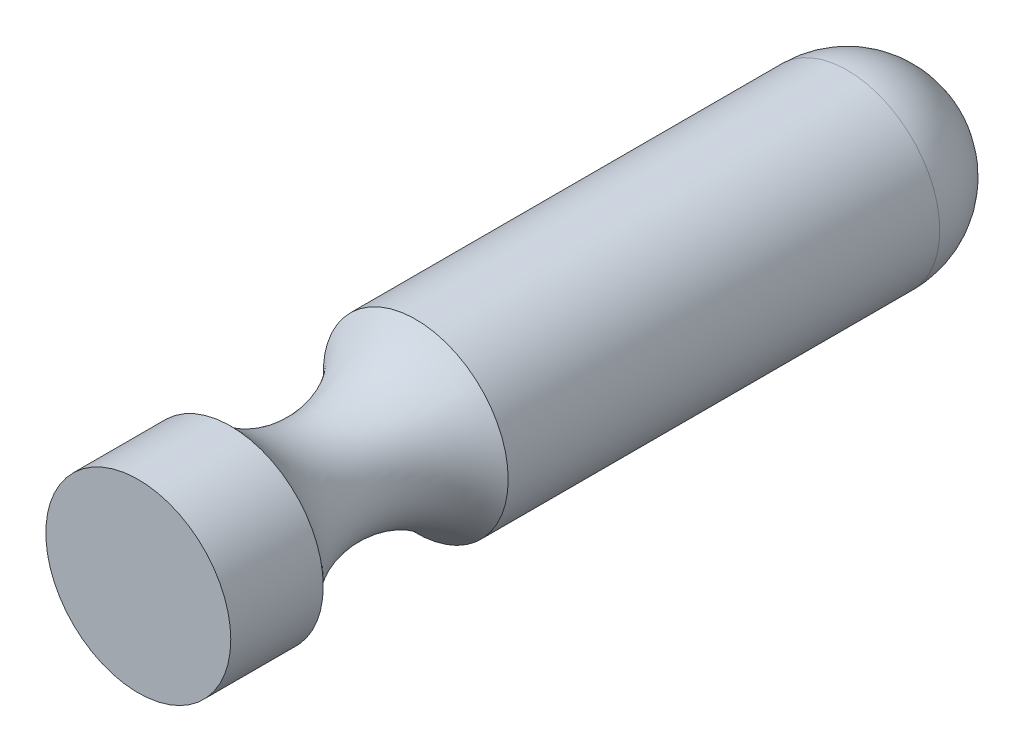
ISO-10303-21;
HEADER;
FILE_DESCRIPTION(('STEP AP214'),'2;1');
FILE_NAME('part.step','',(''),(''),'','','');
FILE_SCHEMA(('AUTOMOTIVE_DESIGN { 1 0 10303 214 1 1 1 1 }'));
ENDSEC;
DATA;
#1=APPLICATION_CONTEXT('core data for automotive mechanical design processes');
#2=APPLICATION_PROTOCOL_DEFINITION('international standard','automotive_design',2000,#1);
#3=PRODUCT_CONTEXT('',#1,'mechanical');
#4=PRODUCT('Part','Part','',(#3));
#5=PRODUCT_RELATED_PRODUCT_CATEGORY('part','',(#4));
#6=PRODUCT_DEFINITION_FORMATION('','',#4);
#7=PRODUCT_DEFINITION_CONTEXT('part definition',#1,'design');
#8=PRODUCT_DEFINITION('design','',#6,#7);
#9=PRODUCT_DEFINITION_SHAPE('','',#8);
#10=(LENGTH_UNIT() NAMED_UNIT(*) SI_UNIT(.MILLI.,.METRE.));
#11=(NAMED_UNIT(*) PLANE_ANGLE_UNIT() SI_UNIT($,.RADIAN.));
#12=(NAMED_UNIT(*) SI_UNIT($,.STERADIAN.) SOLID_ANGLE_UNIT());
#13=UNCERTAINTY_MEASURE_WITH_UNIT(LENGTH_MEASURE(1.E-05),#10,'distance_accuracy_value','');
#14=(GEOMETRIC_REPRESENTATION_CONTEXT(3) GLOBAL_UNCERTAINTY_ASSIGNED_CONTEXT((#13)) GLOBAL_UNIT_ASSIGNED_CONTEXT((#10,
#11,#12)) REPRESENTATION_CONTEXT('',''));
#15=CARTESIAN_POINT('',(0.,0.,0.));
#16=DIRECTION('',(0.,0.,1.));
#17=DIRECTION('',(1.,0.,0.));
#18=AXIS2_PLACEMENT_3D('',#15,#16,#17);
#19=CARTESIAN_POINT('',(2.6581395348837,0.,68.2255813953488));
#20=DIRECTION('',(0.,0.,1.));
#21=DIRECTION('',(1.,0.,0.));
#22=AXIS2_PLACEMENT_3D('',#19,#20,#21);
#23=PLANE('',#22);
#24=CARTESIAN_POINT('',(2.6581395348837,0.,68.2255813953488));
#25=DIRECTION('',(0.,0.,1.));
#26=DIRECTION('',(1.,0.,0.));
#27=AXIS2_PLACEMENT_3D('',#24,#25,#26);
#28=CIRCLE('',#27,19.05);
#29=CARTESIAN_POINT('',(21.7081395348837,0.,68.2255813953488));
#30=VERTEX_POINT('',#29);
#31=EDGE_CURVE('E10',#30,#30,#28,.T.);
#32=ORIENTED_EDGE('',*,*,#31,.T.);
#33=EDGE_LOOP('',(#32));
#34=FACE_BOUND('',#33,.T.);
#35=ADVANCED_FACE('F32',(#34),#23,.T.);
#36=CARTESIAN_POINT('',(2.6581395348837,0.,68.2255813953488));
#37=DIRECTION('',(0.,0.,1.));
#38=DIRECTION('',(1.,0.,0.));
#39=AXIS2_PLACEMENT_3D('',#36,#37,#38);
#40=CYLINDRICAL_SURFACE('',#39,19.05);
#41=CARTESIAN_POINT('',(2.6581395348837,0.,49.1755813953488));
#42=DIRECTION('',(0.,0.,1.));
#43=DIRECTION('',(1.,0.,0.));
#44=AXIS2_PLACEMENT_3D('',#41,#42,#43);
#45=CIRCLE('',#44,19.05);
#46=CARTESIAN_POINT('',(21.7081395348837,0.,49.1755813953488));
#47=VERTEX_POINT('',#46);
#48=EDGE_CURVE('E38',#47,#47,#45,.T.);
#49=ORIENTED_EDGE('',*,*,#48,.T.);
#50=EDGE_LOOP('',(#49));
#51=FACE_BOUND('',#50,.T.);
#52=ORIENTED_EDGE('',*,*,#31,.F.);
#53=EDGE_LOOP('',(#52));
#54=FACE_BOUND('',#53,.T.);
#55=ADVANCED_FACE('F64',(#51,#54),#40,.T.);
#56=CARTESIAN_POINT('',(2.6581395348837,0.,30.1255813953488));
#57=DIRECTION('',(0.,0.,1.));
#58=DIRECTION('',(1.,0.,0.));
#59=AXIS2_PLACEMENT_3D('',#56,#57,#58);
#60=TOROIDAL_SURFACE('',#59,35.8505208252601,25.4);
#61=CARTESIAN_POINT('',(2.6581395348837,0.,11.0755813953488));
#62=DIRECTION('',(0.,0.,1.));
#63=DIRECTION('',(1.,0.,0.));
#64=AXIS2_PLACEMENT_3D('',#61,#62,#63);
#65=CIRCLE('',#64,19.05);
#66=CARTESIAN_POINT('',(21.7081395348837,0.,11.0755813953488));
#67=VERTEX_POINT('',#66);
#68=EDGE_CURVE('E42',#67,#67,#65,.T.);
#69=ORIENTED_EDGE('',*,*,#68,.T.);
#70=EDGE_LOOP('',(#69));
#71=FACE_BOUND('',#70,.T.);
#72=ORIENTED_EDGE('',*,*,#48,.F.);
#73=EDGE_LOOP('',(#72));
#74=FACE_BOUND('',#73,.T.);
#75=ADVANCED_FACE('F61',(#71,#74),#60,.F.);
#76=CARTESIAN_POINT('',(2.6581395348837,0.,68.2255813953488));
#77=DIRECTION('',(0.,0.,1.));
#78=DIRECTION('',(1.,0.,0.));
#79=AXIS2_PLACEMENT_3D('',#76,#77,#78);
#80=CYLINDRICAL_SURFACE('',#79,19.05);
#81=CARTESIAN_POINT('',(2.6581395348837,0.,-77.8244186046512));
#82=DIRECTION('',(0.,0.,1.));
#83=DIRECTION('',(1.,0.,0.));
#84=AXIS2_PLACEMENT_3D('',#81,#82,#83);
#85=CIRCLE('',#84,19.05);
#86=CARTESIAN_POINT('',(21.7081395348837,0.,-77.8244186046512));
#87=VERTEX_POINT('',#86);
#88=EDGE_CURVE('E46',#87,#87,#85,.T.);
#89=ORIENTED_EDGE('',*,*,#88,.T.);
#90=EDGE_LOOP('',(#89));
#91=FACE_BOUND('',#90,.T.);
#92=ORIENTED_EDGE('',*,*,#68,.F.);
#93=EDGE_LOOP('',(#92));
#94=FACE_BOUND('',#93,.T.);
#95=ADVANCED_FACE('F52',(#91,#94),#80,.T.);
#96=CARTESIAN_POINT('',(2.6581395348837,0.,-77.8244186046512));
#97=DIRECTION('',(0.,0.,1.));
#98=DIRECTION('',(1.,0.,0.));
#99=AXIS2_PLACEMENT_3D('',#96,#97,#98);
#100=SPHERICAL_SURFACE('',#99,19.05);
#101=ORIENTED_EDGE('',*,*,#88,.F.);
#102=EDGE_LOOP('',(#101));
#103=FACE_BOUND('',#102,.T.);
#104=ADVANCED_FACE('F55',(#103),#100,.T.);
#105=CLOSED_SHELL('',(#35,#55,#75,#95,#104));
#106=MANIFOLD_SOLID_BREP('B2',#105);
#107=ADVANCED_BREP_SHAPE_REPRESENTATION('',(#18,#106),#14);
#108=SHAPE_DEFINITION_REPRESENTATION(#9,#107);
ENDSEC;
END-ISO-10303-21;
